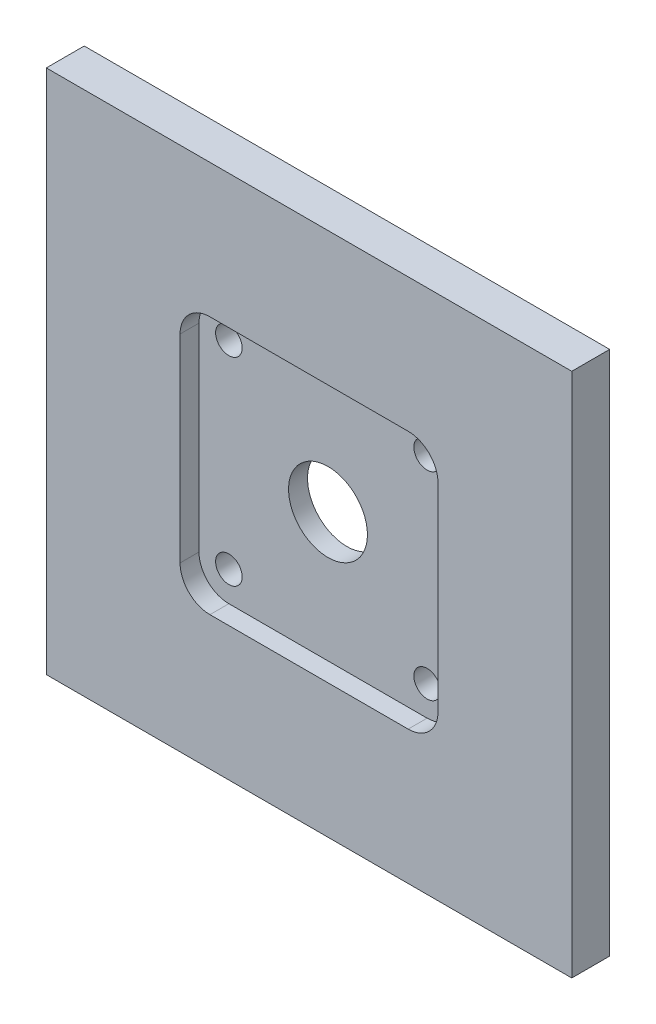
ISO-10303-21;
HEADER;
FILE_DESCRIPTION(('STEP AP214'),'2;1');
FILE_NAME('part.step','',(''),(''),'','','');
FILE_SCHEMA(('AUTOMOTIVE_DESIGN { 1 0 10303 214 1 1 1 1 }'));
ENDSEC;
DATA;
#1=APPLICATION_CONTEXT('core data for automotive mechanical design processes');
#2=APPLICATION_PROTOCOL_DEFINITION('international standard','automotive_design',2000,#1);
#3=PRODUCT_CONTEXT('',#1,'mechanical');
#4=PRODUCT('Part','Part','',(#3));
#5=PRODUCT_RELATED_PRODUCT_CATEGORY('part','',(#4));
#6=PRODUCT_DEFINITION_FORMATION('','',#4);
#7=PRODUCT_DEFINITION_CONTEXT('part definition',#1,'design');
#8=PRODUCT_DEFINITION('design','',#6,#7);
#9=PRODUCT_DEFINITION_SHAPE('','',#8);
#10=(LENGTH_UNIT() NAMED_UNIT(*) SI_UNIT(.MILLI.,.METRE.));
#11=(NAMED_UNIT(*) PLANE_ANGLE_UNIT() SI_UNIT($,.RADIAN.));
#12=(NAMED_UNIT(*) SI_UNIT($,.STERADIAN.) SOLID_ANGLE_UNIT());
#13=UNCERTAINTY_MEASURE_WITH_UNIT(LENGTH_MEASURE(1.E-05),#10,'distance_accuracy_value','');
#14=(GEOMETRIC_REPRESENTATION_CONTEXT(3) GLOBAL_UNCERTAINTY_ASSIGNED_CONTEXT((#13)) GLOBAL_UNIT_ASSIGNED_CONTEXT((#10,
#11,#12)) REPRESENTATION_CONTEXT('',''));
#15=CARTESIAN_POINT('',(0.,0.,0.));
#16=DIRECTION('',(0.,0.,1.));
#17=DIRECTION('',(1.,0.,0.));
#18=AXIS2_PLACEMENT_3D('',#15,#16,#17);
#19=CARTESIAN_POINT('',(0.,0.,15.875));
#20=DIRECTION('',(0.,0.,1.));
#21=DIRECTION('',(1.,0.,0.));
#22=AXIS2_PLACEMENT_3D('',#19,#20,#21);
#23=PLANE('',#22);
#24=DIRECTION('',(0.,-1.,0.));
#25=VECTOR('',#24,1.);
#26=CARTESIAN_POINT('',(-110.,110.,15.875));
#27=LINE('',#26,#25);
#28=CARTESIAN_POINT('',(-110.,110.,15.875));
#29=VERTEX_POINT('',#28);
#30=CARTESIAN_POINT('',(-110.,-110.,15.875));
#31=VERTEX_POINT('',#30);
#32=EDGE_CURVE('E145',#29,#31,#27,.T.);
#33=ORIENTED_EDGE('',*,*,#32,.T.);
#34=DIRECTION('',(1.,0.,0.));
#35=VECTOR('',#34,1.);
#36=CARTESIAN_POINT('',(-110.,-110.,15.875));
#37=LINE('',#36,#35);
#38=CARTESIAN_POINT('',(110.,-110.,15.875));
#39=VERTEX_POINT('',#38);
#40=EDGE_CURVE('E133',#31,#39,#37,.T.);
#41=ORIENTED_EDGE('',*,*,#40,.T.);
#42=DIRECTION('',(0.,1.,0.));
#43=VECTOR('',#42,1.);
#44=CARTESIAN_POINT('',(110.,-110.,15.875));
#45=LINE('',#44,#43);
#46=CARTESIAN_POINT('',(110.,110.,15.875));
#47=VERTEX_POINT('',#46);
#48=EDGE_CURVE('E144',#39,#47,#45,.T.);
#49=ORIENTED_EDGE('',*,*,#48,.T.);
#50=DIRECTION('',(-1.,0.,0.));
#51=VECTOR('',#50,1.);
#52=CARTESIAN_POINT('',(-110.,110.,15.875));
#53=LINE('',#52,#51);
#54=EDGE_CURVE('E149',#47,#29,#53,.T.);
#55=ORIENTED_EDGE('',*,*,#54,.T.);
#56=EDGE_LOOP('',(#33,#41,#49,#55));
#57=FACE_BOUND('',#56,.T.);
#58=DIRECTION('',(0.,-1.,0.));
#59=VECTOR('',#58,1.);
#60=CARTESIAN_POINT('',(54.,54.,15.875));
#61=LINE('',#60,#59);
#62=CARTESIAN_POINT('',(54.,41.5,15.875));
#63=VERTEX_POINT('',#62);
#64=CARTESIAN_POINT('',(54.,-41.5,15.875));
#65=VERTEX_POINT('',#64);
#66=EDGE_CURVE('E216',#63,#65,#61,.T.);
#67=ORIENTED_EDGE('',*,*,#66,.T.);
#68=CARTESIAN_POINT('',(41.5,-41.5,15.875));
#69=DIRECTION('',(0.,0.,1.));
#70=DIRECTION('',(1.,0.,0.));
#71=AXIS2_PLACEMENT_3D('',#68,#69,#70);
#72=CIRCLE('',#71,12.5);
#73=CARTESIAN_POINT('',(41.5,-54.,15.875));
#74=VERTEX_POINT('',#73);
#75=EDGE_CURVE('E208',#65,#74,#72,.F.);
#76=ORIENTED_EDGE('',*,*,#75,.T.);
#77=DIRECTION('',(-1.,0.,0.));
#78=VECTOR('',#77,1.);
#79=CARTESIAN_POINT('',(54.,-54.,15.875));
#80=LINE('',#79,#78);
#81=CARTESIAN_POINT('',(-41.5,-54.,15.875));
#82=VERTEX_POINT('',#81);
#83=EDGE_CURVE('E214',#74,#82,#80,.T.);
#84=ORIENTED_EDGE('',*,*,#83,.T.);
#85=CARTESIAN_POINT('',(-41.5,-41.5,15.875));
#86=DIRECTION('',(0.,0.,1.));
#87=DIRECTION('',(1.,0.,0.));
#88=AXIS2_PLACEMENT_3D('',#85,#86,#87);
#89=CIRCLE('',#88,12.5);
#90=CARTESIAN_POINT('',(-54.,-41.5,15.875));
#91=VERTEX_POINT('',#90);
#92=EDGE_CURVE('E205',#82,#91,#89,.F.);
#93=ORIENTED_EDGE('',*,*,#92,.T.);
#94=DIRECTION('',(0.,1.,0.));
#95=VECTOR('',#94,1.);
#96=CARTESIAN_POINT('',(-54.,-54.,15.875));
#97=LINE('',#96,#95);
#98=CARTESIAN_POINT('',(-54.,41.5,15.875));
#99=VERTEX_POINT('',#98);
#100=EDGE_CURVE('E250',#91,#99,#97,.T.);
#101=ORIENTED_EDGE('',*,*,#100,.T.);
#102=CARTESIAN_POINT('',(-41.5,41.5,15.875));
#103=DIRECTION('',(0.,0.,1.));
#104=DIRECTION('',(1.,0.,0.));
#105=AXIS2_PLACEMENT_3D('',#102,#103,#104);
#106=CIRCLE('',#105,12.5);
#107=CARTESIAN_POINT('',(-41.5,54.,15.875));
#108=VERTEX_POINT('',#107);
#109=EDGE_CURVE('E53',#99,#108,#106,.F.);
#110=ORIENTED_EDGE('',*,*,#109,.T.);
#111=DIRECTION('',(1.,0.,0.));
#112=VECTOR('',#111,1.);
#113=CARTESIAN_POINT('',(-54.,54.,15.875));
#114=LINE('',#113,#112);
#115=CARTESIAN_POINT('',(41.5,54.,15.875));
#116=VERTEX_POINT('',#115);
#117=EDGE_CURVE('E253',#108,#116,#114,.T.);
#118=ORIENTED_EDGE('',*,*,#117,.T.);
#119=CARTESIAN_POINT('',(41.5,41.5,15.875));
#120=DIRECTION('',(0.,0.,1.));
#121=DIRECTION('',(1.,0.,0.));
#122=AXIS2_PLACEMENT_3D('',#119,#120,#121);
#123=CIRCLE('',#122,12.5);
#124=EDGE_CURVE('E11',#116,#63,#123,.F.);
#125=ORIENTED_EDGE('',*,*,#124,.T.);
#126=EDGE_LOOP('',(#67,#76,#84,#93,#101,#110,#118,#125));
#127=FACE_BOUND('',#126,.T.);
#128=ADVANCED_FACE('F44',(#57,#127),#23,.T.);
#129=CARTESIAN_POINT('',(-110.,110.,15.875));
#130=DIRECTION('',(1.,0.,0.));
#131=DIRECTION('',(0.,0.,-1.));
#132=AXIS2_PLACEMENT_3D('',#129,#130,#131);
#133=PLANE('',#132);
#134=DIRECTION('',(0.,-1.,0.));
#135=VECTOR('',#134,1.);
#136=CARTESIAN_POINT('',(-110.,110.,0.));
#137=LINE('',#136,#135);
#138=CARTESIAN_POINT('',(-110.,110.,0.));
#139=VERTEX_POINT('',#138);
#140=CARTESIAN_POINT('',(-110.,-110.,0.));
#141=VERTEX_POINT('',#140);
#142=EDGE_CURVE('E158',#139,#141,#137,.T.);
#143=ORIENTED_EDGE('',*,*,#142,.T.);
#144=DIRECTION('',(0.,0.,-1.));
#145=VECTOR('',#144,1.);
#146=CARTESIAN_POINT('',(-110.,-110.,15.875));
#147=LINE('',#146,#145);
#148=EDGE_CURVE('E137',#31,#141,#147,.T.);
#149=ORIENTED_EDGE('',*,*,#148,.F.);
#150=ORIENTED_EDGE('',*,*,#32,.F.);
#151=DIRECTION('',(0.,0.,-1.));
#152=VECTOR('',#151,1.);
#153=CARTESIAN_POINT('',(-110.,110.,15.875));
#154=LINE('',#153,#152);
#155=EDGE_CURVE('E263',#29,#139,#154,.T.);
#156=ORIENTED_EDGE('',*,*,#155,.T.);
#157=EDGE_LOOP('',(#143,#149,#150,#156));
#158=FACE_BOUND('',#157,.T.);
#159=ADVANCED_FACE('F156',(#158),#133,.F.);
#160=CARTESIAN_POINT('',(-110.,-110.,15.875));
#161=DIRECTION('',(0.,1.,0.));
#162=DIRECTION('',(0.,0.,1.));
#163=AXIS2_PLACEMENT_3D('',#160,#161,#162);
#164=PLANE('',#163);
#165=DIRECTION('',(1.,0.,0.));
#166=VECTOR('',#165,1.);
#167=CARTESIAN_POINT('',(-110.,-110.,0.));
#168=LINE('',#167,#166);
#169=CARTESIAN_POINT('',(110.,-110.,0.));
#170=VERTEX_POINT('',#169);
#171=EDGE_CURVE('E266',#141,#170,#168,.T.);
#172=ORIENTED_EDGE('',*,*,#171,.T.);
#173=DIRECTION('',(0.,0.,-1.));
#174=VECTOR('',#173,1.);
#175=CARTESIAN_POINT('',(110.,-110.,15.875));
#176=LINE('',#175,#174);
#177=EDGE_CURVE('E140',#39,#170,#176,.T.);
#178=ORIENTED_EDGE('',*,*,#177,.F.);
#179=ORIENTED_EDGE('',*,*,#40,.F.);
#180=ORIENTED_EDGE('',*,*,#148,.T.);
#181=EDGE_LOOP('',(#172,#178,#179,#180));
#182=FACE_BOUND('',#181,.T.);
#183=ADVANCED_FACE('F135',(#182),#164,.F.);
#184=CARTESIAN_POINT('',(110.,-110.,15.875));
#185=DIRECTION('',(-1.,0.,0.));
#186=DIRECTION('',(0.,0.,1.));
#187=AXIS2_PLACEMENT_3D('',#184,#185,#186);
#188=PLANE('',#187);
#189=DIRECTION('',(0.,1.,0.));
#190=VECTOR('',#189,1.);
#191=CARTESIAN_POINT('',(110.,-110.,0.));
#192=LINE('',#191,#190);
#193=CARTESIAN_POINT('',(110.,110.,0.));
#194=VERTEX_POINT('',#193);
#195=EDGE_CURVE('E269',#170,#194,#192,.T.);
#196=ORIENTED_EDGE('',*,*,#195,.T.);
#197=DIRECTION('',(0.,0.,-1.));
#198=VECTOR('',#197,1.);
#199=CARTESIAN_POINT('',(110.,110.,15.875));
#200=LINE('',#199,#198);
#201=EDGE_CURVE('E166',#47,#194,#200,.T.);
#202=ORIENTED_EDGE('',*,*,#201,.F.);
#203=ORIENTED_EDGE('',*,*,#48,.F.);
#204=ORIENTED_EDGE('',*,*,#177,.T.);
#205=EDGE_LOOP('',(#196,#202,#203,#204));
#206=FACE_BOUND('',#205,.T.);
#207=ADVANCED_FACE('F285',(#206),#188,.F.);
#208=CARTESIAN_POINT('',(-110.,110.,15.875));
#209=DIRECTION('',(0.,-1.,0.));
#210=DIRECTION('',(0.,0.,-1.));
#211=AXIS2_PLACEMENT_3D('',#208,#209,#210);
#212=PLANE('',#211);
#213=DIRECTION('',(-1.,0.,0.));
#214=VECTOR('',#213,1.);
#215=CARTESIAN_POINT('',(-110.,110.,0.));
#216=LINE('',#215,#214);
#217=EDGE_CURVE('E154',#194,#139,#216,.T.);
#218=ORIENTED_EDGE('',*,*,#217,.T.);
#219=ORIENTED_EDGE('',*,*,#155,.F.);
#220=ORIENTED_EDGE('',*,*,#54,.F.);
#221=ORIENTED_EDGE('',*,*,#201,.T.);
#222=EDGE_LOOP('',(#218,#219,#220,#221));
#223=FACE_BOUND('',#222,.T.);
#224=ADVANCED_FACE('F280',(#223),#212,.F.);
#225=CARTESIAN_POINT('',(0.,0.,0.));
#226=DIRECTION('',(0.,0.,1.));
#227=DIRECTION('',(1.,0.,0.));
#228=AXIS2_PLACEMENT_3D('',#225,#226,#227);
#229=PLANE('',#228);
#230=CARTESIAN_POINT('',(0.,0.,0.));
#231=DIRECTION('',(0.,0.,1.));
#232=DIRECTION('',(1.,0.,0.));
#233=AXIS2_PLACEMENT_3D('',#230,#231,#232);
#234=CIRCLE('',#233,16.51);
#235=CARTESIAN_POINT('',(16.51,0.,0.));
#236=VERTEX_POINT('',#235);
#237=EDGE_CURVE('E316',#236,#236,#234,.T.);
#238=ORIENTED_EDGE('',*,*,#237,.T.);
#239=EDGE_LOOP('',(#238));
#240=FACE_BOUND('',#239,.T.);
#241=CARTESIAN_POINT('',(41.5,-41.5,0.));
#242=DIRECTION('',(0.,0.,1.));
#243=DIRECTION('',(-1.,0.,0.));
#244=AXIS2_PLACEMENT_3D('',#241,#242,#243);
#245=CIRCLE('',#244,5.55625);
#246=CARTESIAN_POINT('',(35.94375,-41.5,0.));
#247=VERTEX_POINT('',#246);
#248=EDGE_CURVE('E320',#247,#247,#245,.T.);
#249=ORIENTED_EDGE('',*,*,#248,.T.);
#250=EDGE_LOOP('',(#249));
#251=FACE_BOUND('',#250,.T.);
#252=CARTESIAN_POINT('',(-41.5,-41.5,0.));
#253=DIRECTION('',(0.,0.,-1.));
#254=DIRECTION('',(1.,0.,0.));
#255=AXIS2_PLACEMENT_3D('',#252,#253,#254);
#256=CIRCLE('',#255,5.55625);
#257=CARTESIAN_POINT('',(-35.94375,-41.5,0.));
#258=VERTEX_POINT('',#257);
#259=EDGE_CURVE('E324',#258,#258,#256,.T.);
#260=ORIENTED_EDGE('',*,*,#259,.F.);
#261=EDGE_LOOP('',(#260));
#262=FACE_BOUND('',#261,.T.);
#263=CARTESIAN_POINT('',(41.5,41.5,0.));
#264=DIRECTION('',(0.,0.,-1.));
#265=DIRECTION('',(-1.,0.,0.));
#266=AXIS2_PLACEMENT_3D('',#263,#264,#265);
#267=CIRCLE('',#266,5.55625);
#268=CARTESIAN_POINT('',(35.94375,41.5,0.));
#269=VERTEX_POINT('',#268);
#270=EDGE_CURVE('E328',#269,#269,#267,.T.);
#271=ORIENTED_EDGE('',*,*,#270,.F.);
#272=EDGE_LOOP('',(#271));
#273=FACE_BOUND('',#272,.T.);
#274=CARTESIAN_POINT('',(-41.5,41.5,0.));
#275=DIRECTION('',(0.,0.,1.));
#276=DIRECTION('',(1.,0.,0.));
#277=AXIS2_PLACEMENT_3D('',#274,#275,#276);
#278=CIRCLE('',#277,5.55625);
#279=CARTESIAN_POINT('',(-35.94375,41.5,0.));
#280=VERTEX_POINT('',#279);
#281=EDGE_CURVE('E254',#280,#280,#278,.T.);
#282=ORIENTED_EDGE('',*,*,#281,.T.);
#283=EDGE_LOOP('',(#282));
#284=FACE_BOUND('',#283,.T.);
#285=ORIENTED_EDGE('',*,*,#142,.F.);
#286=ORIENTED_EDGE('',*,*,#217,.F.);
#287=ORIENTED_EDGE('',*,*,#195,.F.);
#288=ORIENTED_EDGE('',*,*,#171,.F.);
#289=EDGE_LOOP('',(#285,#286,#287,#288));
#290=FACE_BOUND('',#289,.T.);
#291=ADVANCED_FACE('F284',(#240,#251,#262,#273,#284,#290),#229,.F.);
#292=CARTESIAN_POINT('',(-54.,-54.,7.9375));
#293=DIRECTION('',(1.,0.,0.));
#294=DIRECTION('',(0.,1.,0.));
#295=AXIS2_PLACEMENT_3D('',#292,#293,#294);
#296=PLANE('',#295);
#297=ORIENTED_EDGE('',*,*,#100,.F.);
#298=DIRECTION('',(0.,0.,1.));
#299=VECTOR('',#298,1.);
#300=CARTESIAN_POINT('',(-54.,-41.5,7.9375));
#301=LINE('',#300,#299);
#302=CARTESIAN_POINT('',(-54.,-41.5,7.9375));
#303=VERTEX_POINT('',#302);
#304=EDGE_CURVE('E177',#91,#303,#301,.F.);
#305=ORIENTED_EDGE('',*,*,#304,.T.);
#306=DIRECTION('',(0.,1.,0.));
#307=VECTOR('',#306,1.);
#308=CARTESIAN_POINT('',(-54.,-54.,7.9375));
#309=LINE('',#308,#307);
#310=CARTESIAN_POINT('',(-54.,41.5,7.9375));
#311=VERTEX_POINT('',#310);
#312=EDGE_CURVE('E226',#303,#311,#309,.T.);
#313=ORIENTED_EDGE('',*,*,#312,.T.);
#314=DIRECTION('',(0.,0.,1.));
#315=VECTOR('',#314,1.);
#316=CARTESIAN_POINT('',(-54.,41.5,15.875));
#317=LINE('',#316,#315);
#318=EDGE_CURVE('E173',#311,#99,#317,.T.);
#319=ORIENTED_EDGE('',*,*,#318,.T.);
#320=EDGE_LOOP('',(#297,#305,#313,#319));
#321=FACE_BOUND('',#320,.T.);
#322=ADVANCED_FACE('F303',(#321),#296,.T.);
#323=CARTESIAN_POINT('',(-54.,54.,7.9375));
#324=DIRECTION('',(0.,-1.,0.));
#325=DIRECTION('',(0.,0.,-1.));
#326=AXIS2_PLACEMENT_3D('',#323,#324,#325);
#327=PLANE('',#326);
#328=ORIENTED_EDGE('',*,*,#117,.F.);
#329=DIRECTION('',(0.,0.,1.));
#330=VECTOR('',#329,1.);
#331=CARTESIAN_POINT('',(-41.5,54.,7.9375));
#332=LINE('',#331,#330);
#333=CARTESIAN_POINT('',(-41.5,54.,7.9375));
#334=VERTEX_POINT('',#333);
#335=EDGE_CURVE('E202',#108,#334,#332,.F.);
#336=ORIENTED_EDGE('',*,*,#335,.T.);
#337=DIRECTION('',(1.,0.,0.));
#338=VECTOR('',#337,1.);
#339=CARTESIAN_POINT('',(-54.,54.,7.9375));
#340=LINE('',#339,#338);
#341=CARTESIAN_POINT('',(41.5,54.,7.9375));
#342=VERTEX_POINT('',#341);
#343=EDGE_CURVE('E241',#334,#342,#340,.T.);
#344=ORIENTED_EDGE('',*,*,#343,.T.);
#345=DIRECTION('',(0.,0.,1.));
#346=VECTOR('',#345,1.);
#347=CARTESIAN_POINT('',(41.5,54.,15.875));
#348=LINE('',#347,#346);
#349=EDGE_CURVE('E199',#342,#116,#348,.T.);
#350=ORIENTED_EDGE('',*,*,#349,.T.);
#351=EDGE_LOOP('',(#328,#336,#344,#350));
#352=FACE_BOUND('',#351,.T.);
#353=ADVANCED_FACE('F311',(#352),#327,.T.);
#354=CARTESIAN_POINT('',(54.,54.,7.9375));
#355=DIRECTION('',(-1.,0.,0.));
#356=DIRECTION('',(0.,-1.,0.));
#357=AXIS2_PLACEMENT_3D('',#354,#355,#356);
#358=PLANE('',#357);
#359=DIRECTION('',(0.,-1.,0.));
#360=VECTOR('',#359,1.);
#361=CARTESIAN_POINT('',(54.,54.,7.9375));
#362=LINE('',#361,#360);
#363=CARTESIAN_POINT('',(54.,41.5,7.9375));
#364=VERTEX_POINT('',#363);
#365=CARTESIAN_POINT('',(54.,-41.5,7.9375));
#366=VERTEX_POINT('',#365);
#367=EDGE_CURVE('E235',#364,#366,#362,.T.);
#368=ORIENTED_EDGE('',*,*,#367,.T.);
#369=DIRECTION('',(0.,0.,1.));
#370=VECTOR('',#369,1.);
#371=CARTESIAN_POINT('',(54.,-41.5,15.875));
#372=LINE('',#371,#370);
#373=EDGE_CURVE('E195',#366,#65,#372,.T.);
#374=ORIENTED_EDGE('',*,*,#373,.T.);
#375=ORIENTED_EDGE('',*,*,#66,.F.);
#376=DIRECTION('',(0.,0.,1.));
#377=VECTOR('',#376,1.);
#378=CARTESIAN_POINT('',(54.,41.5,7.9375));
#379=LINE('',#378,#377);
#380=EDGE_CURVE('E192',#63,#364,#379,.F.);
#381=ORIENTED_EDGE('',*,*,#380,.T.);
#382=EDGE_LOOP('',(#368,#374,#375,#381));
#383=FACE_BOUND('',#382,.T.);
#384=ADVANCED_FACE('F239',(#383),#358,.T.);
#385=CARTESIAN_POINT('',(54.,-54.,7.9375));
#386=DIRECTION('',(0.,1.,0.));
#387=DIRECTION('',(0.,0.,1.));
#388=AXIS2_PLACEMENT_3D('',#385,#386,#387);
#389=PLANE('',#388);
#390=DIRECTION('',(-1.,0.,0.));
#391=VECTOR('',#390,1.);
#392=CARTESIAN_POINT('',(54.,-54.,7.9375));
#393=LINE('',#392,#391);
#394=CARTESIAN_POINT('',(41.5,-54.,7.9375));
#395=VERTEX_POINT('',#394);
#396=CARTESIAN_POINT('',(-41.5,-54.,7.9375));
#397=VERTEX_POINT('',#396);
#398=EDGE_CURVE('E237',#395,#397,#393,.T.);
#399=ORIENTED_EDGE('',*,*,#398,.T.);
#400=DIRECTION('',(0.,0.,1.));
#401=VECTOR('',#400,1.);
#402=CARTESIAN_POINT('',(-41.5,-54.,15.875));
#403=LINE('',#402,#401);
#404=EDGE_CURVE('E164',#397,#82,#403,.T.);
#405=ORIENTED_EDGE('',*,*,#404,.T.);
#406=ORIENTED_EDGE('',*,*,#83,.F.);
#407=DIRECTION('',(0.,0.,1.));
#408=VECTOR('',#407,1.);
#409=CARTESIAN_POINT('',(41.5,-54.,7.9375));
#410=LINE('',#409,#408);
#411=EDGE_CURVE('E160',#74,#395,#410,.F.);
#412=ORIENTED_EDGE('',*,*,#411,.T.);
#413=EDGE_LOOP('',(#399,#405,#406,#412));
#414=FACE_BOUND('',#413,.T.);
#415=ADVANCED_FACE('F222',(#414),#389,.T.);
#416=CARTESIAN_POINT('',(0.,0.,7.9375));
#417=DIRECTION('',(0.,0.,-1.));
#418=DIRECTION('',(-1.,0.,0.));
#419=AXIS2_PLACEMENT_3D('',#416,#417,#418);
#420=PLANE('',#419);
#421=CARTESIAN_POINT('',(0.,0.,7.9375));
#422=DIRECTION('',(0.,0.,1.));
#423=DIRECTION('',(1.,0.,0.));
#424=AXIS2_PLACEMENT_3D('',#421,#422,#423);
#425=CIRCLE('',#424,16.51);
#426=CARTESIAN_POINT('',(16.51,0.,7.9375));
#427=VERTEX_POINT('',#426);
#428=EDGE_CURVE('E468',#427,#427,#425,.T.);
#429=ORIENTED_EDGE('',*,*,#428,.F.);
#430=EDGE_LOOP('',(#429));
#431=FACE_BOUND('',#430,.T.);
#432=CARTESIAN_POINT('',(41.5,-41.5,7.9375));
#433=DIRECTION('',(0.,0.,1.));
#434=DIRECTION('',(-1.,0.,0.));
#435=AXIS2_PLACEMENT_3D('',#432,#433,#434);
#436=CIRCLE('',#435,5.55625);
#437=CARTESIAN_POINT('',(35.94375,-41.5,7.9375));
#438=VERTEX_POINT('',#437);
#439=EDGE_CURVE('E472',#438,#438,#436,.T.);
#440=ORIENTED_EDGE('',*,*,#439,.F.);
#441=EDGE_LOOP('',(#440));
#442=FACE_BOUND('',#441,.T.);
#443=CARTESIAN_POINT('',(-41.5,-41.5,7.9375));
#444=DIRECTION('',(0.,0.,-1.));
#445=DIRECTION('',(1.,0.,0.));
#446=AXIS2_PLACEMENT_3D('',#443,#444,#445);
#447=CIRCLE('',#446,5.55625);
#448=CARTESIAN_POINT('',(-35.94375,-41.5,7.9375));
#449=VERTEX_POINT('',#448);
#450=EDGE_CURVE('E477',#449,#449,#447,.T.);
#451=ORIENTED_EDGE('',*,*,#450,.T.);
#452=EDGE_LOOP('',(#451));
#453=FACE_BOUND('',#452,.T.);
#454=CARTESIAN_POINT('',(41.5,41.5,7.9375));
#455=DIRECTION('',(0.,0.,-1.));
#456=DIRECTION('',(-1.,0.,0.));
#457=AXIS2_PLACEMENT_3D('',#454,#455,#456);
#458=CIRCLE('',#457,5.55625);
#459=CARTESIAN_POINT('',(35.94375,41.5,7.9375));
#460=VERTEX_POINT('',#459);
#461=EDGE_CURVE('E339',#460,#460,#458,.T.);
#462=ORIENTED_EDGE('',*,*,#461,.T.);
#463=EDGE_LOOP('',(#462));
#464=FACE_BOUND('',#463,.T.);
#465=CARTESIAN_POINT('',(-41.5,41.5,7.9375));
#466=DIRECTION('',(0.,0.,1.));
#467=DIRECTION('',(1.,0.,0.));
#468=AXIS2_PLACEMENT_3D('',#465,#466,#467);
#469=CIRCLE('',#468,5.55625);
#470=CARTESIAN_POINT('',(-35.94375,41.5,7.9375));
#471=VERTEX_POINT('',#470);
#472=EDGE_CURVE('E333',#471,#471,#469,.T.);
#473=ORIENTED_EDGE('',*,*,#472,.F.);
#474=EDGE_LOOP('',(#473));
#475=FACE_BOUND('',#474,.T.);
#476=ORIENTED_EDGE('',*,*,#312,.F.);
#477=CARTESIAN_POINT('',(-41.5,-41.5,7.9375));
#478=DIRECTION('',(0.,0.,-1.));
#479=DIRECTION('',(-1.,0.,0.));
#480=AXIS2_PLACEMENT_3D('',#477,#478,#479);
#481=CIRCLE('',#480,12.5);
#482=EDGE_CURVE('E189',#303,#397,#481,.F.);
#483=ORIENTED_EDGE('',*,*,#482,.T.);
#484=ORIENTED_EDGE('',*,*,#398,.F.);
#485=CARTESIAN_POINT('',(41.5,-41.5,7.9375));
#486=DIRECTION('',(0.,0.,-1.));
#487=DIRECTION('',(-1.,0.,0.));
#488=AXIS2_PLACEMENT_3D('',#485,#486,#487);
#489=CIRCLE('',#488,12.5);
#490=EDGE_CURVE('E186',#395,#366,#489,.F.);
#491=ORIENTED_EDGE('',*,*,#490,.T.);
#492=ORIENTED_EDGE('',*,*,#367,.F.);
#493=CARTESIAN_POINT('',(41.5,41.5,7.9375));
#494=DIRECTION('',(0.,0.,-1.));
#495=DIRECTION('',(-1.,0.,0.));
#496=AXIS2_PLACEMENT_3D('',#493,#494,#495);
#497=CIRCLE('',#496,12.5);
#498=EDGE_CURVE('E180',#364,#342,#497,.F.);
#499=ORIENTED_EDGE('',*,*,#498,.T.);
#500=ORIENTED_EDGE('',*,*,#343,.F.);
#501=CARTESIAN_POINT('',(-41.5,41.5,7.9375));
#502=DIRECTION('',(0.,0.,-1.));
#503=DIRECTION('',(-1.,0.,0.));
#504=AXIS2_PLACEMENT_3D('',#501,#502,#503);
#505=CIRCLE('',#504,12.5);
#506=EDGE_CURVE('E183',#334,#311,#505,.F.);
#507=ORIENTED_EDGE('',*,*,#506,.T.);
#508=EDGE_LOOP('',(#476,#483,#484,#491,#492,#499,#500,#507));
#509=FACE_BOUND('',#508,.T.);
#510=ADVANCED_FACE('F234',(#431,#442,#453,#464,#475,#509),#420,.F.);
#511=CARTESIAN_POINT('',(-41.5,-41.5,7.9375));
#512=DIRECTION('',(0.,0.,-1.));
#513=DIRECTION('',(-1.,0.,0.));
#514=AXIS2_PLACEMENT_3D('',#511,#512,#513);
#515=CYLINDRICAL_SURFACE('',#514,12.5);
#516=ORIENTED_EDGE('',*,*,#482,.F.);
#517=ORIENTED_EDGE('',*,*,#304,.F.);
#518=ORIENTED_EDGE('',*,*,#92,.F.);
#519=ORIENTED_EDGE('',*,*,#404,.F.);
#520=EDGE_LOOP('',(#516,#517,#518,#519));
#521=FACE_BOUND('',#520,.T.);
#522=ADVANCED_FACE('F364',(#521),#515,.F.);
#523=CARTESIAN_POINT('',(41.5,-41.5,7.9375));
#524=DIRECTION('',(0.,0.,-1.));
#525=DIRECTION('',(-1.,0.,0.));
#526=AXIS2_PLACEMENT_3D('',#523,#524,#525);
#527=CYLINDRICAL_SURFACE('',#526,12.5);
#528=ORIENTED_EDGE('',*,*,#490,.F.);
#529=ORIENTED_EDGE('',*,*,#411,.F.);
#530=ORIENTED_EDGE('',*,*,#75,.F.);
#531=ORIENTED_EDGE('',*,*,#373,.F.);
#532=EDGE_LOOP('',(#528,#529,#530,#531));
#533=FACE_BOUND('',#532,.T.);
#534=ADVANCED_FACE('F229',(#533),#527,.F.);
#535=CARTESIAN_POINT('',(-41.5,41.5,7.9375));
#536=DIRECTION('',(0.,0.,-1.));
#537=DIRECTION('',(-1.,0.,0.));
#538=AXIS2_PLACEMENT_3D('',#535,#536,#537);
#539=CYLINDRICAL_SURFACE('',#538,12.5);
#540=ORIENTED_EDGE('',*,*,#506,.F.);
#541=ORIENTED_EDGE('',*,*,#335,.F.);
#542=ORIENTED_EDGE('',*,*,#109,.F.);
#543=ORIENTED_EDGE('',*,*,#318,.F.);
#544=EDGE_LOOP('',(#540,#541,#542,#543));
#545=FACE_BOUND('',#544,.T.);
#546=ADVANCED_FACE('F349',(#545),#539,.F.);
#547=CARTESIAN_POINT('',(41.5,41.5,7.9375));
#548=DIRECTION('',(0.,0.,-1.));
#549=DIRECTION('',(-1.,0.,0.));
#550=AXIS2_PLACEMENT_3D('',#547,#548,#549);
#551=CYLINDRICAL_SURFACE('',#550,12.5);
#552=ORIENTED_EDGE('',*,*,#498,.F.);
#553=ORIENTED_EDGE('',*,*,#380,.F.);
#554=ORIENTED_EDGE('',*,*,#124,.F.);
#555=ORIENTED_EDGE('',*,*,#349,.F.);
#556=EDGE_LOOP('',(#552,#553,#554,#555));
#557=FACE_BOUND('',#556,.T.);
#558=ADVANCED_FACE('F46',(#557),#551,.F.);
#559=CARTESIAN_POINT('',(-41.5,41.5,0.));
#560=DIRECTION('',(0.,0.,1.));
#561=DIRECTION('',(1.,0.,0.));
#562=AXIS2_PLACEMENT_3D('',#559,#560,#561);
#563=CYLINDRICAL_SURFACE('',#562,5.55625);
#564=ORIENTED_EDGE('',*,*,#281,.F.);
#565=EDGE_LOOP('',(#564));
#566=FACE_BOUND('',#565,.T.);
#567=ORIENTED_EDGE('',*,*,#472,.T.);
#568=EDGE_LOOP('',(#567));
#569=FACE_BOUND('',#568,.T.);
#570=ADVANCED_FACE('F354',(#566,#569),#563,.F.);
#571=CARTESIAN_POINT('',(41.5,41.5,0.));
#572=DIRECTION('',(0.,0.,1.));
#573=DIRECTION('',(1.,0.,0.));
#574=AXIS2_PLACEMENT_3D('',#571,#572,#573);
#575=CYLINDRICAL_SURFACE('',#574,5.55625);
#576=ORIENTED_EDGE('',*,*,#270,.T.);
#577=EDGE_LOOP('',(#576));
#578=FACE_BOUND('',#577,.T.);
#579=ORIENTED_EDGE('',*,*,#461,.F.);
#580=EDGE_LOOP('',(#579));
#581=FACE_BOUND('',#580,.T.);
#582=ADVANCED_FACE('F359',(#578,#581),#575,.F.);
#583=CARTESIAN_POINT('',(-41.5,-41.5,0.));
#584=DIRECTION('',(0.,0.,1.));
#585=DIRECTION('',(1.,0.,0.));
#586=AXIS2_PLACEMENT_3D('',#583,#584,#585);
#587=CYLINDRICAL_SURFACE('',#586,5.55625);
#588=ORIENTED_EDGE('',*,*,#259,.T.);
#589=EDGE_LOOP('',(#588));
#590=FACE_BOUND('',#589,.T.);
#591=ORIENTED_EDGE('',*,*,#450,.F.);
#592=EDGE_LOOP('',(#591));
#593=FACE_BOUND('',#592,.T.);
#594=ADVANCED_FACE('F436',(#590,#593),#587,.F.);
#595=CARTESIAN_POINT('',(41.5,-41.5,0.));
#596=DIRECTION('',(0.,0.,1.));
#597=DIRECTION('',(1.,0.,0.));
#598=AXIS2_PLACEMENT_3D('',#595,#596,#597);
#599=CYLINDRICAL_SURFACE('',#598,5.55625);
#600=ORIENTED_EDGE('',*,*,#248,.F.);
#601=EDGE_LOOP('',(#600));
#602=FACE_BOUND('',#601,.T.);
#603=ORIENTED_EDGE('',*,*,#439,.T.);
#604=EDGE_LOOP('',(#603));
#605=FACE_BOUND('',#604,.T.);
#606=ADVANCED_FACE('F445',(#602,#605),#599,.F.);
#607=CARTESIAN_POINT('',(0.,0.,0.));
#608=DIRECTION('',(0.,0.,1.));
#609=DIRECTION('',(1.,0.,0.));
#610=AXIS2_PLACEMENT_3D('',#607,#608,#609);
#611=CYLINDRICAL_SURFACE('',#610,16.51);
#612=ORIENTED_EDGE('',*,*,#237,.F.);
#613=EDGE_LOOP('',(#612));
#614=FACE_BOUND('',#613,.T.);
#615=ORIENTED_EDGE('',*,*,#428,.T.);
#616=EDGE_LOOP('',(#615));
#617=FACE_BOUND('',#616,.T.);
#618=ADVANCED_FACE('F454',(#614,#617),#611,.F.);
#619=CLOSED_SHELL('',(#128,#159,#183,#207,#224,#291,#322,#353,#384,#415,#510,#522,#534,#546,
#558,#570,#582,#594,#606,#618));
#620=MANIFOLD_SOLID_BREP('B2',#619);
#621=ADVANCED_BREP_SHAPE_REPRESENTATION('',(#18,#620),#14);
#622=SHAPE_DEFINITION_REPRESENTATION(#9,#621);
ENDSEC;
END-ISO-10303-21;
